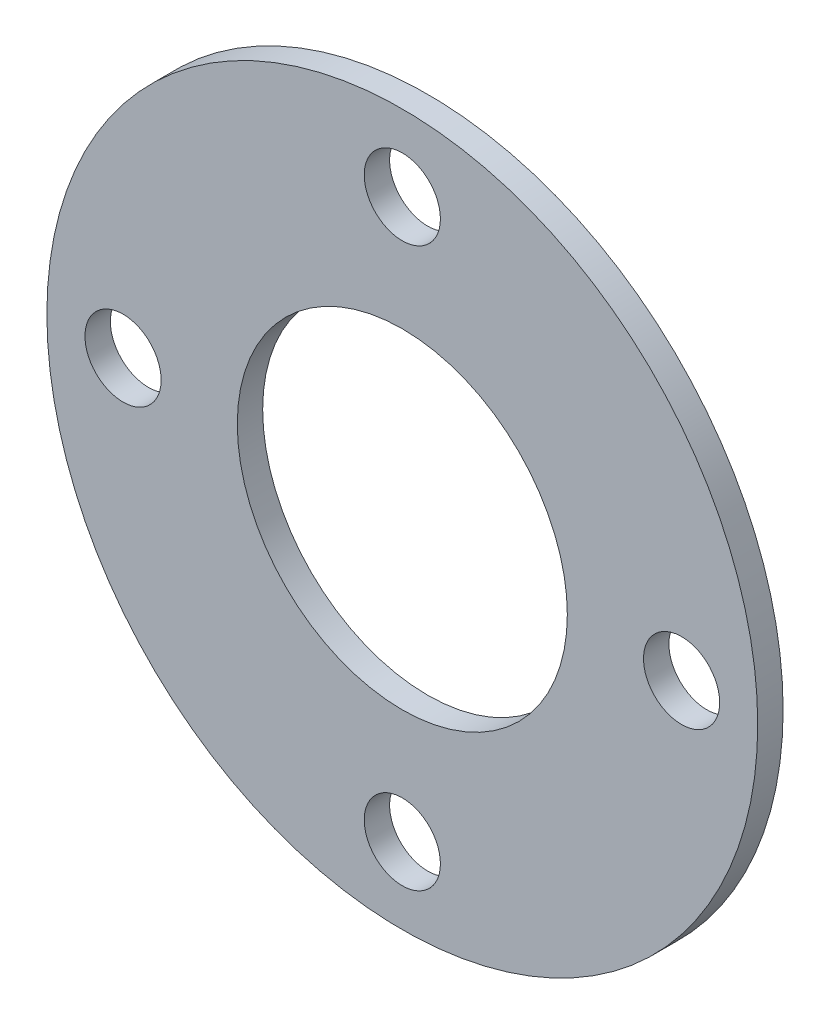
ISO-10303-21;
HEADER;
FILE_DESCRIPTION(('STEP AP214'),'2;1');
FILE_NAME('part.step','',(''),(''),'','','');
FILE_SCHEMA(('AUTOMOTIVE_DESIGN { 1 0 10303 214 1 1 1 1 }'));
ENDSEC;
DATA;
#1=APPLICATION_CONTEXT('core data for automotive mechanical design processes');
#2=APPLICATION_PROTOCOL_DEFINITION('international standard','automotive_design',2000,#1);
#3=PRODUCT_CONTEXT('',#1,'mechanical');
#4=PRODUCT('Part','Part','',(#3));
#5=PRODUCT_RELATED_PRODUCT_CATEGORY('part','',(#4));
#6=PRODUCT_DEFINITION_FORMATION('','',#4);
#7=PRODUCT_DEFINITION_CONTEXT('part definition',#1,'design');
#8=PRODUCT_DEFINITION('design','',#6,#7);
#9=PRODUCT_DEFINITION_SHAPE('','',#8);
#10=(LENGTH_UNIT() NAMED_UNIT(*) SI_UNIT(.MILLI.,.METRE.));
#11=(NAMED_UNIT(*) PLANE_ANGLE_UNIT() SI_UNIT($,.RADIAN.));
#12=(NAMED_UNIT(*) SI_UNIT($,.STERADIAN.) SOLID_ANGLE_UNIT());
#13=UNCERTAINTY_MEASURE_WITH_UNIT(LENGTH_MEASURE(1.E-05),#10,'distance_accuracy_value','');
#14=(GEOMETRIC_REPRESENTATION_CONTEXT(3) GLOBAL_UNCERTAINTY_ASSIGNED_CONTEXT((#13)) GLOBAL_UNIT_ASSIGNED_CONTEXT((#10,
#11,#12)) REPRESENTATION_CONTEXT('',''));
#15=CARTESIAN_POINT('',(0.,0.,0.));
#16=DIRECTION('',(0.,0.,1.));
#17=DIRECTION('',(1.,0.,0.));
#18=AXIS2_PLACEMENT_3D('',#15,#16,#17);
#19=CARTESIAN_POINT('',(0.,0.,1.));
#20=DIRECTION('',(0.,0.,1.));
#21=DIRECTION('',(1.,0.,0.));
#22=AXIS2_PLACEMENT_3D('',#19,#20,#21);
#23=PLANE('',#22);
#24=CARTESIAN_POINT('',(-11.,0.,1.));
#25=DIRECTION('',(0.,0.,1.));
#26=DIRECTION('',(1.,0.,0.));
#27=AXIS2_PLACEMENT_3D('',#24,#25,#26);
#28=CIRCLE('',#27,1.5);
#29=CARTESIAN_POINT('',(-9.5,0.,1.));
#30=VERTEX_POINT('',#29);
#31=EDGE_CURVE('E62',#30,#30,#28,.T.);
#32=ORIENTED_EDGE('',*,*,#31,.F.);
#33=EDGE_LOOP('',(#32));
#34=FACE_BOUND('',#33,.T.);
#35=CARTESIAN_POINT('',(0.,0.,1.));
#36=DIRECTION('',(0.,0.,1.));
#37=DIRECTION('',(1.,0.,0.));
#38=AXIS2_PLACEMENT_3D('',#35,#36,#37);
#39=CIRCLE('',#38,6.5);
#40=CARTESIAN_POINT('',(6.5,0.,1.));
#41=VERTEX_POINT('',#40);
#42=EDGE_CURVE('E50',#41,#41,#39,.T.);
#43=ORIENTED_EDGE('',*,*,#42,.F.);
#44=EDGE_LOOP('',(#43));
#45=FACE_BOUND('',#44,.T.);
#46=CARTESIAN_POINT('',(0.,0.,1.));
#47=DIRECTION('',(0.,0.,1.));
#48=DIRECTION('',(1.,0.,0.));
#49=AXIS2_PLACEMENT_3D('',#46,#47,#48);
#50=CIRCLE('',#49,14.);
#51=CARTESIAN_POINT('',(14.,0.,1.));
#52=VERTEX_POINT('',#51);
#53=EDGE_CURVE('E10',#52,#52,#50,.T.);
#54=ORIENTED_EDGE('',*,*,#53,.T.);
#55=EDGE_LOOP('',(#54));
#56=FACE_BOUND('',#55,.T.);
#57=CARTESIAN_POINT('',(11.,0.,1.));
#58=DIRECTION('',(0.,0.,1.));
#59=DIRECTION('',(1.,0.,0.));
#60=AXIS2_PLACEMENT_3D('',#57,#58,#59);
#61=CIRCLE('',#60,1.5);
#62=CARTESIAN_POINT('',(12.5,0.,1.));
#63=VERTEX_POINT('',#62);
#64=EDGE_CURVE('E45',#63,#63,#61,.T.);
#65=ORIENTED_EDGE('',*,*,#64,.F.);
#66=EDGE_LOOP('',(#65));
#67=FACE_BOUND('',#66,.T.);
#68=CARTESIAN_POINT('',(0.,-11.,1.));
#69=DIRECTION('',(0.,0.,1.));
#70=DIRECTION('',(1.,0.,0.));
#71=AXIS2_PLACEMENT_3D('',#68,#69,#70);
#72=CIRCLE('',#71,1.5);
#73=CARTESIAN_POINT('',(1.49999999999996,-11.,1.));
#74=VERTEX_POINT('',#73);
#75=EDGE_CURVE('E56',#74,#74,#72,.T.);
#76=ORIENTED_EDGE('',*,*,#75,.F.);
#77=EDGE_LOOP('',(#76));
#78=FACE_BOUND('',#77,.T.);
#79=CARTESIAN_POINT('',(1.15218884181823E-13,11.,1.));
#80=DIRECTION('',(0.,0.,1.));
#81=DIRECTION('',(1.,0.,0.));
#82=AXIS2_PLACEMENT_3D('',#79,#80,#81);
#83=CIRCLE('',#82,1.5);
#84=CARTESIAN_POINT('',(1.50000000000011,11.,1.));
#85=VERTEX_POINT('',#84);
#86=EDGE_CURVE('E68',#85,#85,#83,.T.);
#87=ORIENTED_EDGE('',*,*,#86,.F.);
#88=EDGE_LOOP('',(#87));
#89=FACE_BOUND('',#88,.T.);
#90=ADVANCED_FACE('F34',(#34,#45,#56,#67,#78,#89),#23,.T.);
#91=CARTESIAN_POINT('',(0.,0.,0.));
#92=DIRECTION('',(0.,0.,1.));
#93=DIRECTION('',(1.,0.,0.));
#94=AXIS2_PLACEMENT_3D('',#91,#92,#93);
#95=PLANE('',#94);
#96=CARTESIAN_POINT('',(0.,0.,0.));
#97=DIRECTION('',(0.,0.,1.));
#98=DIRECTION('',(1.,0.,0.));
#99=AXIS2_PLACEMENT_3D('',#96,#97,#98);
#100=CIRCLE('',#99,14.);
#101=CARTESIAN_POINT('',(14.,0.,0.));
#102=VERTEX_POINT('',#101);
#103=EDGE_CURVE('E38',#102,#102,#100,.T.);
#104=ORIENTED_EDGE('',*,*,#103,.F.);
#105=EDGE_LOOP('',(#104));
#106=FACE_BOUND('',#105,.T.);
#107=CARTESIAN_POINT('',(11.,0.,0.));
#108=DIRECTION('',(0.,0.,1.));
#109=DIRECTION('',(1.,0.,0.));
#110=AXIS2_PLACEMENT_3D('',#107,#108,#109);
#111=CIRCLE('',#110,1.5);
#112=CARTESIAN_POINT('',(12.5,0.,0.));
#113=VERTEX_POINT('',#112);
#114=EDGE_CURVE('E47',#113,#113,#111,.T.);
#115=ORIENTED_EDGE('',*,*,#114,.T.);
#116=EDGE_LOOP('',(#115));
#117=FACE_BOUND('',#116,.T.);
#118=CARTESIAN_POINT('',(0.,0.,0.));
#119=DIRECTION('',(0.,0.,1.));
#120=DIRECTION('',(1.,0.,0.));
#121=AXIS2_PLACEMENT_3D('',#118,#119,#120);
#122=CIRCLE('',#121,6.5);
#123=CARTESIAN_POINT('',(6.5,0.,0.));
#124=VERTEX_POINT('',#123);
#125=EDGE_CURVE('E53',#124,#124,#122,.T.);
#126=ORIENTED_EDGE('',*,*,#125,.T.);
#127=EDGE_LOOP('',(#126));
#128=FACE_BOUND('',#127,.T.);
#129=CARTESIAN_POINT('',(0.,-11.,0.));
#130=DIRECTION('',(0.,0.,1.));
#131=DIRECTION('',(1.,0.,0.));
#132=AXIS2_PLACEMENT_3D('',#129,#130,#131);
#133=CIRCLE('',#132,1.5);
#134=CARTESIAN_POINT('',(1.49999999999996,-11.,0.));
#135=VERTEX_POINT('',#134);
#136=EDGE_CURVE('E59',#135,#135,#133,.T.);
#137=ORIENTED_EDGE('',*,*,#136,.T.);
#138=EDGE_LOOP('',(#137));
#139=FACE_BOUND('',#138,.T.);
#140=CARTESIAN_POINT('',(-11.,0.,0.));
#141=DIRECTION('',(0.,0.,1.));
#142=DIRECTION('',(1.,0.,0.));
#143=AXIS2_PLACEMENT_3D('',#140,#141,#142);
#144=CIRCLE('',#143,1.5);
#145=CARTESIAN_POINT('',(-9.5,0.,0.));
#146=VERTEX_POINT('',#145);
#147=EDGE_CURVE('E65',#146,#146,#144,.T.);
#148=ORIENTED_EDGE('',*,*,#147,.T.);
#149=EDGE_LOOP('',(#148));
#150=FACE_BOUND('',#149,.T.);
#151=CARTESIAN_POINT('',(1.15218884181823E-13,11.,0.));
#152=DIRECTION('',(0.,0.,1.));
#153=DIRECTION('',(1.,0.,0.));
#154=AXIS2_PLACEMENT_3D('',#151,#152,#153);
#155=CIRCLE('',#154,1.5);
#156=CARTESIAN_POINT('',(1.50000000000011,11.,0.));
#157=VERTEX_POINT('',#156);
#158=EDGE_CURVE('E71',#157,#157,#155,.T.);
#159=ORIENTED_EDGE('',*,*,#158,.T.);
#160=EDGE_LOOP('',(#159));
#161=FACE_BOUND('',#160,.T.);
#162=ADVANCED_FACE('F81',(#106,#117,#128,#139,#150,#161),#95,.F.);
#163=CARTESIAN_POINT('',(0.,0.,1.));
#164=DIRECTION('',(0.,0.,-1.));
#165=DIRECTION('',(-1.,0.,0.));
#166=AXIS2_PLACEMENT_3D('',#163,#164,#165);
#167=CYLINDRICAL_SURFACE('',#166,14.);
#168=ORIENTED_EDGE('',*,*,#53,.F.);
#169=EDGE_LOOP('',(#168));
#170=FACE_BOUND('',#169,.T.);
#171=ORIENTED_EDGE('',*,*,#103,.T.);
#172=EDGE_LOOP('',(#171));
#173=FACE_BOUND('',#172,.T.);
#174=ADVANCED_FACE('F36',(#170,#173),#167,.T.);
#175=CARTESIAN_POINT('',(11.,0.,1.));
#176=DIRECTION('',(0.,0.,-1.));
#177=DIRECTION('',(-1.,0.,0.));
#178=AXIS2_PLACEMENT_3D('',#175,#176,#177);
#179=CYLINDRICAL_SURFACE('',#178,1.5);
#180=ORIENTED_EDGE('',*,*,#64,.T.);
#181=EDGE_LOOP('',(#180));
#182=FACE_BOUND('',#181,.T.);
#183=ORIENTED_EDGE('',*,*,#114,.F.);
#184=EDGE_LOOP('',(#183));
#185=FACE_BOUND('',#184,.T.);
#186=ADVANCED_FACE('F91',(#182,#185),#179,.F.);
#187=CARTESIAN_POINT('',(0.,0.,1.));
#188=DIRECTION('',(0.,0.,-1.));
#189=DIRECTION('',(-1.,0.,0.));
#190=AXIS2_PLACEMENT_3D('',#187,#188,#189);
#191=CYLINDRICAL_SURFACE('',#190,6.5);
#192=ORIENTED_EDGE('',*,*,#42,.T.);
#193=EDGE_LOOP('',(#192));
#194=FACE_BOUND('',#193,.T.);
#195=ORIENTED_EDGE('',*,*,#125,.F.);
#196=EDGE_LOOP('',(#195));
#197=FACE_BOUND('',#196,.T.);
#198=ADVANCED_FACE('F94',(#194,#197),#191,.F.);
#199=CARTESIAN_POINT('',(0.,-11.,1.));
#200=DIRECTION('',(0.,0.,-1.));
#201=DIRECTION('',(-1.,0.,0.));
#202=AXIS2_PLACEMENT_3D('',#199,#200,#201);
#203=CYLINDRICAL_SURFACE('',#202,1.5);
#204=ORIENTED_EDGE('',*,*,#75,.T.);
#205=EDGE_LOOP('',(#204));
#206=FACE_BOUND('',#205,.T.);
#207=ORIENTED_EDGE('',*,*,#136,.F.);
#208=EDGE_LOOP('',(#207));
#209=FACE_BOUND('',#208,.T.);
#210=ADVANCED_FACE('F98',(#206,#209),#203,.F.);
#211=CARTESIAN_POINT('',(-11.,0.,1.));
#212=DIRECTION('',(0.,0.,-1.));
#213=DIRECTION('',(-1.,0.,0.));
#214=AXIS2_PLACEMENT_3D('',#211,#212,#213);
#215=CYLINDRICAL_SURFACE('',#214,1.5);
#216=ORIENTED_EDGE('',*,*,#31,.T.);
#217=EDGE_LOOP('',(#216));
#218=FACE_BOUND('',#217,.T.);
#219=ORIENTED_EDGE('',*,*,#147,.F.);
#220=EDGE_LOOP('',(#219));
#221=FACE_BOUND('',#220,.T.);
#222=ADVANCED_FACE('F102',(#218,#221),#215,.F.);
#223=CARTESIAN_POINT('',(1.15218884181823E-13,11.,1.));
#224=DIRECTION('',(0.,0.,-1.));
#225=DIRECTION('',(-1.,0.,0.));
#226=AXIS2_PLACEMENT_3D('',#223,#224,#225);
#227=CYLINDRICAL_SURFACE('',#226,1.5);
#228=ORIENTED_EDGE('',*,*,#86,.T.);
#229=EDGE_LOOP('',(#228));
#230=FACE_BOUND('',#229,.T.);
#231=ORIENTED_EDGE('',*,*,#158,.F.);
#232=EDGE_LOOP('',(#231));
#233=FACE_BOUND('',#232,.T.);
#234=ADVANCED_FACE('F77',(#230,#233),#227,.F.);
#235=CLOSED_SHELL('',(#90,#162,#174,#186,#198,#210,#222,#234));
#236=MANIFOLD_SOLID_BREP('B2',#235);
#237=ADVANCED_BREP_SHAPE_REPRESENTATION('',(#18,#236),#14);
#238=SHAPE_DEFINITION_REPRESENTATION(#9,#237);
ENDSEC;
END-ISO-10303-21;
